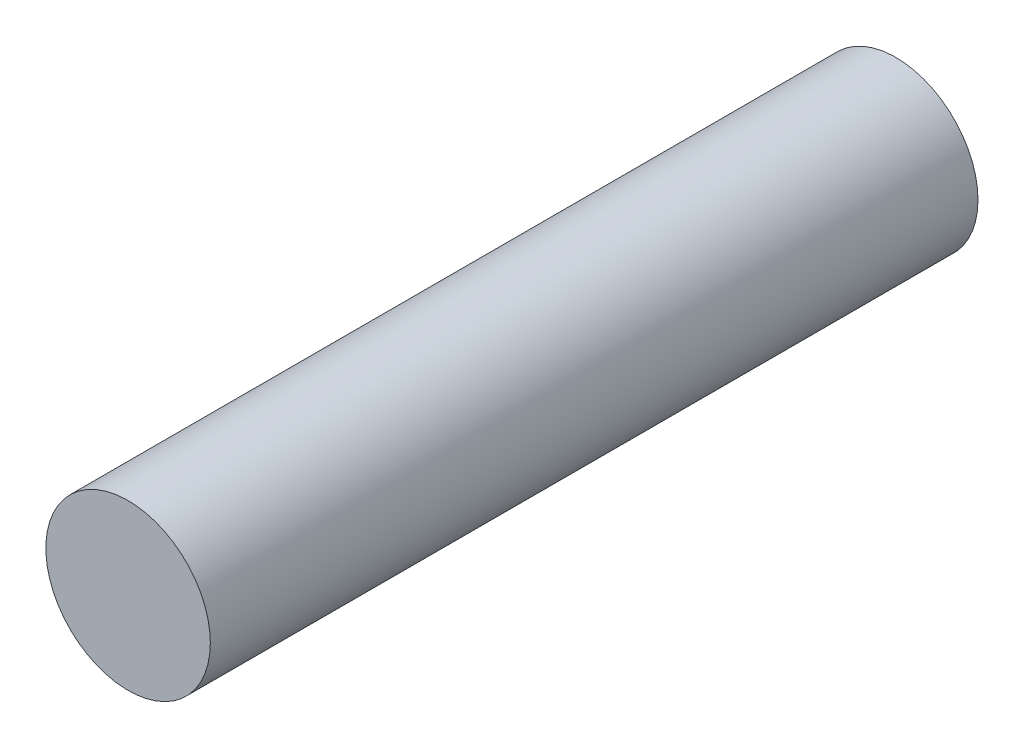
ISO-10303-21;
HEADER;
FILE_DESCRIPTION(('STEP AP214'),'2;1');
FILE_NAME('part.step','',(''),(''),'','','');
FILE_SCHEMA(('AUTOMOTIVE_DESIGN { 1 0 10303 214 1 1 1 1 }'));
ENDSEC;
DATA;
#1=APPLICATION_CONTEXT('core data for automotive mechanical design processes');
#2=APPLICATION_PROTOCOL_DEFINITION('international standard','automotive_design',2000,#1);
#3=PRODUCT_CONTEXT('',#1,'mechanical');
#4=PRODUCT('Part','Part','',(#3));
#5=PRODUCT_RELATED_PRODUCT_CATEGORY('part','',(#4));
#6=PRODUCT_DEFINITION_FORMATION('','',#4);
#7=PRODUCT_DEFINITION_CONTEXT('part definition',#1,'design');
#8=PRODUCT_DEFINITION('design','',#6,#7);
#9=PRODUCT_DEFINITION_SHAPE('','',#8);
#10=(LENGTH_UNIT() NAMED_UNIT(*) SI_UNIT(.MILLI.,.METRE.));
#11=(NAMED_UNIT(*) PLANE_ANGLE_UNIT() SI_UNIT($,.RADIAN.));
#12=(NAMED_UNIT(*) SI_UNIT($,.STERADIAN.) SOLID_ANGLE_UNIT());
#13=UNCERTAINTY_MEASURE_WITH_UNIT(LENGTH_MEASURE(1.E-05),#10,'distance_accuracy_value','');
#14=(GEOMETRIC_REPRESENTATION_CONTEXT(3) GLOBAL_UNCERTAINTY_ASSIGNED_CONTEXT((#13)) GLOBAL_UNIT_ASSIGNED_CONTEXT((#10,
#11,#12)) REPRESENTATION_CONTEXT('',''));
#15=CARTESIAN_POINT('',(0.,0.,0.));
#16=DIRECTION('',(0.,0.,1.));
#17=DIRECTION('',(1.,0.,0.));
#18=AXIS2_PLACEMENT_3D('',#15,#16,#17);
#19=CARTESIAN_POINT('',(0.,0.,28.));
#20=DIRECTION('',(0.,0.,-1.));
#21=DIRECTION('',(-1.,0.,0.));
#22=AXIS2_PLACEMENT_3D('',#19,#20,#21);
#23=CYLINDRICAL_SURFACE('',#22,6.);
#24=CARTESIAN_POINT('',(0.,0.,28.));
#25=DIRECTION('',(0.,0.,1.));
#26=DIRECTION('',(1.,0.,0.));
#27=AXIS2_PLACEMENT_3D('',#24,#25,#26);
#28=CIRCLE('',#27,6.);
#29=CARTESIAN_POINT('',(6.,0.,28.));
#30=VERTEX_POINT('',#29);
#31=EDGE_CURVE('E10',#30,#30,#28,.T.);
#32=ORIENTED_EDGE('',*,*,#31,.F.);
#33=EDGE_LOOP('',(#32));
#34=FACE_BOUND('',#33,.T.);
#35=CARTESIAN_POINT('',(0.,0.,-28.));
#36=DIRECTION('',(0.,0.,1.));
#37=DIRECTION('',(1.,0.,0.));
#38=AXIS2_PLACEMENT_3D('',#35,#36,#37);
#39=CIRCLE('',#38,6.);
#40=CARTESIAN_POINT('',(6.,0.,-28.));
#41=VERTEX_POINT('',#40);
#42=EDGE_CURVE('E38',#41,#41,#39,.T.);
#43=ORIENTED_EDGE('',*,*,#42,.T.);
#44=EDGE_LOOP('',(#43));
#45=FACE_BOUND('',#44,.T.);
#46=ADVANCED_FACE('F35',(#34,#45),#23,.T.);
#47=CARTESIAN_POINT('',(0.,0.,28.));
#48=DIRECTION('',(0.,0.,1.));
#49=DIRECTION('',(1.,0.,0.));
#50=AXIS2_PLACEMENT_3D('',#47,#48,#49);
#51=PLANE('',#50);
#52=ORIENTED_EDGE('',*,*,#31,.T.);
#53=EDGE_LOOP('',(#52));
#54=FACE_BOUND('',#53,.T.);
#55=ADVANCED_FACE('F50',(#54),#51,.T.);
#56=CARTESIAN_POINT('',(0.,0.,-28.));
#57=DIRECTION('',(0.,0.,1.));
#58=DIRECTION('',(1.,0.,0.));
#59=AXIS2_PLACEMENT_3D('',#56,#57,#58);
#60=PLANE('',#59);
#61=ORIENTED_EDGE('',*,*,#42,.F.);
#62=EDGE_LOOP('',(#61));
#63=FACE_BOUND('',#62,.T.);
#64=ADVANCED_FACE('F48',(#63),#60,.F.);
#65=CLOSED_SHELL('',(#46,#55,#64));
#66=MANIFOLD_SOLID_BREP('B2',#65);
#67=ADVANCED_BREP_SHAPE_REPRESENTATION('',(#18,#66),#14);
#68=SHAPE_DEFINITION_REPRESENTATION(#9,#67);
ENDSEC;
END-ISO-10303-21;
